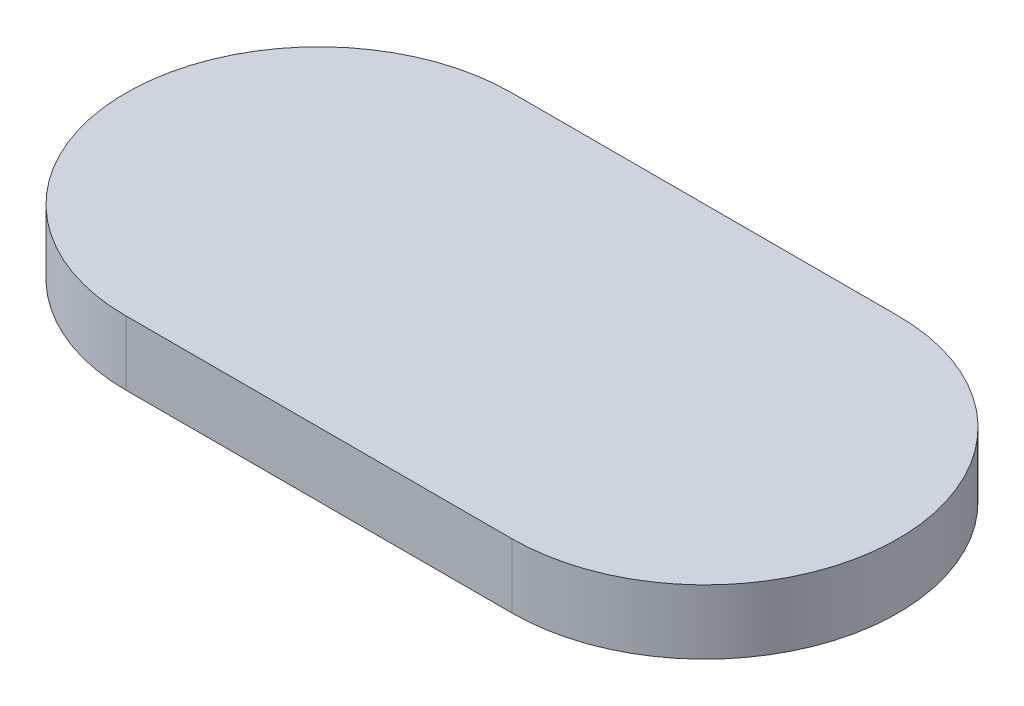
ISO-10303-21;
HEADER;
FILE_DESCRIPTION(('STEP AP214'),'2;1');
FILE_NAME('part.step','',(''),(''),'','','');
FILE_SCHEMA(('AUTOMOTIVE_DESIGN { 1 0 10303 214 1 1 1 1 }'));
ENDSEC;
DATA;
#1=APPLICATION_CONTEXT('core data for automotive mechanical design processes');
#2=APPLICATION_PROTOCOL_DEFINITION('international standard','automotive_design',2000,#1);
#3=PRODUCT_CONTEXT('',#1,'mechanical');
#4=PRODUCT('Part','Part','',(#3));
#5=PRODUCT_RELATED_PRODUCT_CATEGORY('part','',(#4));
#6=PRODUCT_DEFINITION_FORMATION('','',#4);
#7=PRODUCT_DEFINITION_CONTEXT('part definition',#1,'design');
#8=PRODUCT_DEFINITION('design','',#6,#7);
#9=PRODUCT_DEFINITION_SHAPE('','',#8);
#10=(LENGTH_UNIT() NAMED_UNIT(*) SI_UNIT(.MILLI.,.METRE.));
#11=(NAMED_UNIT(*) PLANE_ANGLE_UNIT() SI_UNIT($,.RADIAN.));
#12=(NAMED_UNIT(*) SI_UNIT($,.STERADIAN.) SOLID_ANGLE_UNIT());
#13=UNCERTAINTY_MEASURE_WITH_UNIT(LENGTH_MEASURE(1.E-05),#10,'distance_accuracy_value','');
#14=(GEOMETRIC_REPRESENTATION_CONTEXT(3) GLOBAL_UNCERTAINTY_ASSIGNED_CONTEXT((#13)) GLOBAL_UNIT_ASSIGNED_CONTEXT((#10,
#11,#12)) REPRESENTATION_CONTEXT('',''));
#15=CARTESIAN_POINT('',(0.,0.,0.));
#16=DIRECTION('',(0.,0.,1.));
#17=DIRECTION('',(1.,0.,0.));
#18=AXIS2_PLACEMENT_3D('',#15,#16,#17);
#19=CARTESIAN_POINT('',(0.,5.,0.));
#20=DIRECTION('',(0.,-1.,0.));
#21=DIRECTION('',(0.,0.,-1.));
#22=AXIS2_PLACEMENT_3D('',#19,#20,#21);
#23=CYLINDRICAL_SURFACE('',#22,15.);
#24=CARTESIAN_POINT('',(0.,0.,0.));
#25=DIRECTION('',(0.,1.,0.));
#26=DIRECTION('',(0.,0.,1.));
#27=AXIS2_PLACEMENT_3D('',#24,#25,#26);
#28=CIRCLE('',#27,15.);
#29=CARTESIAN_POINT('',(0.,0.,-15.));
#30=VERTEX_POINT('',#29);
#31=CARTESIAN_POINT('',(0.,0.,15.));
#32=VERTEX_POINT('',#31);
#33=EDGE_CURVE('E114',#30,#32,#28,.T.);
#34=ORIENTED_EDGE('',*,*,#33,.T.);
#35=DIRECTION('',(0.,-1.,0.));
#36=VECTOR('',#35,1.);
#37=CARTESIAN_POINT('',(0.,5.,15.));
#38=LINE('',#37,#36);
#39=CARTESIAN_POINT('',(0.,5.,15.));
#40=VERTEX_POINT('',#39);
#41=EDGE_CURVE('E52',#40,#32,#38,.T.);
#42=ORIENTED_EDGE('',*,*,#41,.F.);
#43=CARTESIAN_POINT('',(0.,5.,0.));
#44=DIRECTION('',(0.,1.,0.));
#45=DIRECTION('',(0.,0.,1.));
#46=AXIS2_PLACEMENT_3D('',#43,#44,#45);
#47=CIRCLE('',#46,15.);
#48=CARTESIAN_POINT('',(0.,5.,-15.));
#49=VERTEX_POINT('',#48);
#50=EDGE_CURVE('E96',#49,#40,#47,.T.);
#51=ORIENTED_EDGE('',*,*,#50,.F.);
#52=DIRECTION('',(0.,-1.,0.));
#53=VECTOR('',#52,1.);
#54=CARTESIAN_POINT('',(0.,5.,-15.));
#55=LINE('',#54,#53);
#56=EDGE_CURVE('E110',#49,#30,#55,.T.);
#57=ORIENTED_EDGE('',*,*,#56,.T.);
#58=EDGE_LOOP('',(#34,#42,#51,#57));
#59=FACE_BOUND('',#58,.T.);
#60=ADVANCED_FACE('F43',(#59),#23,.T.);
#61=CARTESIAN_POINT('',(0.,5.,15.));
#62=DIRECTION('',(0.,0.,-1.));
#63=DIRECTION('',(-1.,0.,0.));
#64=AXIS2_PLACEMENT_3D('',#61,#62,#63);
#65=PLANE('',#64);
#66=DIRECTION('',(1.,0.,0.));
#67=VECTOR('',#66,1.);
#68=CARTESIAN_POINT('',(0.,0.,15.));
#69=LINE('',#68,#67);
#70=CARTESIAN_POINT('',(30.,0.,15.));
#71=VERTEX_POINT('',#70);
#72=EDGE_CURVE('E102',#32,#71,#69,.T.);
#73=ORIENTED_EDGE('',*,*,#72,.T.);
#74=DIRECTION('',(0.,-1.,0.));
#75=VECTOR('',#74,1.);
#76=CARTESIAN_POINT('',(30.,5.,15.));
#77=LINE('',#76,#75);
#78=CARTESIAN_POINT('',(30.,5.,15.));
#79=VERTEX_POINT('',#78);
#80=EDGE_CURVE('E100',#79,#71,#77,.T.);
#81=ORIENTED_EDGE('',*,*,#80,.F.);
#82=DIRECTION('',(1.,0.,0.));
#83=VECTOR('',#82,1.);
#84=CARTESIAN_POINT('',(0.,5.,15.));
#85=LINE('',#84,#83);
#86=EDGE_CURVE('E91',#40,#79,#85,.T.);
#87=ORIENTED_EDGE('',*,*,#86,.F.);
#88=ORIENTED_EDGE('',*,*,#41,.T.);
#89=EDGE_LOOP('',(#73,#81,#87,#88));
#90=FACE_BOUND('',#89,.T.);
#91=ADVANCED_FACE('F101',(#90),#65,.F.);
#92=CARTESIAN_POINT('',(30.,5.,0.));
#93=DIRECTION('',(0.,-1.,0.));
#94=DIRECTION('',(0.,0.,-1.));
#95=AXIS2_PLACEMENT_3D('',#92,#93,#94);
#96=CYLINDRICAL_SURFACE('',#95,15.);
#97=CARTESIAN_POINT('',(30.,0.,0.));
#98=DIRECTION('',(0.,1.,0.));
#99=DIRECTION('',(0.,0.,1.));
#100=AXIS2_PLACEMENT_3D('',#97,#98,#99);
#101=CIRCLE('',#100,15.);
#102=CARTESIAN_POINT('',(30.,0.,-15.));
#103=VERTEX_POINT('',#102);
#104=EDGE_CURVE('E77',#71,#103,#101,.T.);
#105=ORIENTED_EDGE('',*,*,#104,.T.);
#106=DIRECTION('',(0.,-1.,0.));
#107=VECTOR('',#106,1.);
#108=CARTESIAN_POINT('',(30.,5.,-15.));
#109=LINE('',#108,#107);
#110=CARTESIAN_POINT('',(30.,5.,-15.));
#111=VERTEX_POINT('',#110);
#112=EDGE_CURVE('E104',#111,#103,#109,.T.);
#113=ORIENTED_EDGE('',*,*,#112,.F.);
#114=CARTESIAN_POINT('',(30.,5.,0.));
#115=DIRECTION('',(0.,1.,0.));
#116=DIRECTION('',(0.,0.,1.));
#117=AXIS2_PLACEMENT_3D('',#114,#115,#116);
#118=CIRCLE('',#117,15.);
#119=EDGE_CURVE('E94',#79,#111,#118,.T.);
#120=ORIENTED_EDGE('',*,*,#119,.F.);
#121=ORIENTED_EDGE('',*,*,#80,.T.);
#122=EDGE_LOOP('',(#105,#113,#120,#121));
#123=FACE_BOUND('',#122,.T.);
#124=ADVANCED_FACE('F106',(#123),#96,.T.);
#125=CARTESIAN_POINT('',(0.,5.,-15.));
#126=DIRECTION('',(0.,0.,1.));
#127=DIRECTION('',(1.,0.,0.));
#128=AXIS2_PLACEMENT_3D('',#125,#126,#127);
#129=PLANE('',#128);
#130=DIRECTION('',(-1.,0.,0.));
#131=VECTOR('',#130,1.);
#132=CARTESIAN_POINT('',(0.,0.,-15.));
#133=LINE('',#132,#131);
#134=EDGE_CURVE('E83',#103,#30,#133,.T.);
#135=ORIENTED_EDGE('',*,*,#134,.T.);
#136=ORIENTED_EDGE('',*,*,#56,.F.);
#137=DIRECTION('',(-1.,0.,0.));
#138=VECTOR('',#137,1.);
#139=CARTESIAN_POINT('',(0.,5.,-15.));
#140=LINE('',#139,#138);
#141=EDGE_CURVE('E60',#111,#49,#140,.T.);
#142=ORIENTED_EDGE('',*,*,#141,.F.);
#143=ORIENTED_EDGE('',*,*,#112,.T.);
#144=EDGE_LOOP('',(#135,#136,#142,#143));
#145=FACE_BOUND('',#144,.T.);
#146=ADVANCED_FACE('F144',(#145),#129,.F.);
#147=CARTESIAN_POINT('',(0.,5.,0.));
#148=DIRECTION('',(0.,1.,0.));
#149=DIRECTION('',(0.,0.,1.));
#150=AXIS2_PLACEMENT_3D('',#147,#148,#149);
#151=PLANE('',#150);
#152=ORIENTED_EDGE('',*,*,#50,.T.);
#153=ORIENTED_EDGE('',*,*,#86,.T.);
#154=ORIENTED_EDGE('',*,*,#119,.T.);
#155=ORIENTED_EDGE('',*,*,#141,.T.);
#156=EDGE_LOOP('',(#152,#153,#154,#155));
#157=FACE_BOUND('',#156,.T.);
#158=ADVANCED_FACE('F92',(#157),#151,.T.);
#159=CARTESIAN_POINT('',(0.,0.,0.));
#160=DIRECTION('',(0.,1.,0.));
#161=DIRECTION('',(0.,0.,1.));
#162=AXIS2_PLACEMENT_3D('',#159,#160,#161);
#163=PLANE('',#162);
#164=CARTESIAN_POINT('',(0.,0.,0.));
#165=DIRECTION('',(0.,1.,0.));
#166=DIRECTION('',(0.,0.,1.));
#167=AXIS2_PLACEMENT_3D('',#164,#165,#166);
#168=CIRCLE('',#167,2.5);
#169=CARTESIAN_POINT('',(0.,0.,2.5));
#170=VERTEX_POINT('',#169);
#171=EDGE_CURVE('E11',#170,#170,#168,.F.);
#172=ORIENTED_EDGE('',*,*,#171,.F.);
#173=EDGE_LOOP('',(#172));
#174=FACE_BOUND('',#173,.T.);
#175=ORIENTED_EDGE('',*,*,#33,.F.);
#176=ORIENTED_EDGE('',*,*,#134,.F.);
#177=ORIENTED_EDGE('',*,*,#104,.F.);
#178=ORIENTED_EDGE('',*,*,#72,.F.);
#179=EDGE_LOOP('',(#175,#176,#177,#178));
#180=FACE_BOUND('',#179,.T.);
#181=ADVANCED_FACE('F132',(#174,#180),#163,.F.);
#182=CARTESIAN_POINT('',(0.,-5.,0.));
#183=DIRECTION('',(0.,1.,0.));
#184=DIRECTION('',(0.,0.,1.));
#185=AXIS2_PLACEMENT_3D('',#182,#183,#184);
#186=CYLINDRICAL_SURFACE('',#185,2.5);
#187=CARTESIAN_POINT('',(0.,-5.,0.));
#188=DIRECTION('',(0.,-1.,0.));
#189=DIRECTION('',(0.,0.,-1.));
#190=AXIS2_PLACEMENT_3D('',#187,#188,#189);
#191=CIRCLE('',#190,2.5);
#192=CARTESIAN_POINT('',(0.,-5.,-2.5));
#193=VERTEX_POINT('',#192);
#194=EDGE_CURVE('E118',#193,#193,#191,.T.);
#195=ORIENTED_EDGE('',*,*,#194,.F.);
#196=EDGE_LOOP('',(#195));
#197=FACE_BOUND('',#196,.T.);
#198=ORIENTED_EDGE('',*,*,#171,.T.);
#199=EDGE_LOOP('',(#198));
#200=FACE_BOUND('',#199,.T.);
#201=ADVANCED_FACE('F134',(#197,#200),#186,.T.);
#202=CARTESIAN_POINT('',(0.,-5.,0.));
#203=DIRECTION('',(0.,-1.,0.));
#204=DIRECTION('',(0.,0.,-1.));
#205=AXIS2_PLACEMENT_3D('',#202,#203,#204);
#206=PLANE('',#205);
#207=ORIENTED_EDGE('',*,*,#194,.T.);
#208=EDGE_LOOP('',(#207));
#209=FACE_BOUND('',#208,.T.);
#210=ADVANCED_FACE('F141',(#209),#206,.T.);
#211=CLOSED_SHELL('',(#60,#91,#124,#146,#158,#181,#201,#210));
#212=MANIFOLD_SOLID_BREP('B2',#211);
#213=ADVANCED_BREP_SHAPE_REPRESENTATION('',(#18,#212),#14);
#214=SHAPE_DEFINITION_REPRESENTATION(#9,#213);
ENDSEC;
END-ISO-10303-21;
